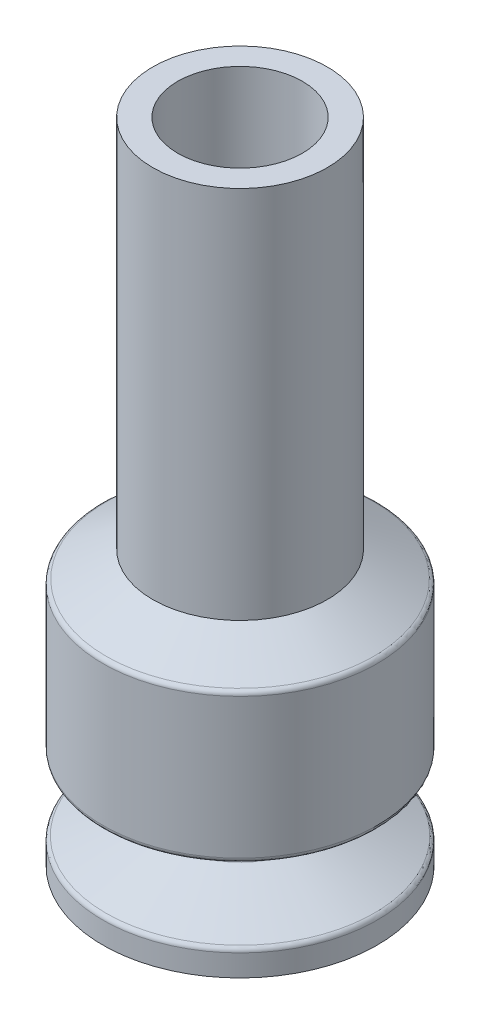
ISO-10303-21;
HEADER;
FILE_DESCRIPTION(('STEP AP214'),'2;1');
FILE_NAME('part.step','',(''),(''),'','','');
FILE_SCHEMA(('AUTOMOTIVE_DESIGN { 1 0 10303 214 1 1 1 1 }'));
ENDSEC;
DATA;
#1=APPLICATION_CONTEXT('core data for automotive mechanical design processes');
#2=APPLICATION_PROTOCOL_DEFINITION('international standard','automotive_design',2000,#1);
#3=PRODUCT_CONTEXT('',#1,'mechanical');
#4=PRODUCT('Part','Part','',(#3));
#5=PRODUCT_RELATED_PRODUCT_CATEGORY('part','',(#4));
#6=PRODUCT_DEFINITION_FORMATION('','',#4);
#7=PRODUCT_DEFINITION_CONTEXT('part definition',#1,'design');
#8=PRODUCT_DEFINITION('design','',#6,#7);
#9=PRODUCT_DEFINITION_SHAPE('','',#8);
#10=(LENGTH_UNIT() NAMED_UNIT(*) SI_UNIT(.MILLI.,.METRE.));
#11=(NAMED_UNIT(*) PLANE_ANGLE_UNIT() SI_UNIT($,.RADIAN.));
#12=(NAMED_UNIT(*) SI_UNIT($,.STERADIAN.) SOLID_ANGLE_UNIT());
#13=UNCERTAINTY_MEASURE_WITH_UNIT(LENGTH_MEASURE(1.E-05),#10,'distance_accuracy_value','');
#14=(GEOMETRIC_REPRESENTATION_CONTEXT(3) GLOBAL_UNCERTAINTY_ASSIGNED_CONTEXT((#13)) GLOBAL_UNIT_ASSIGNED_CONTEXT((#10,
#11,#12)) REPRESENTATION_CONTEXT('',''));
#15=CARTESIAN_POINT('',(0.,0.,0.));
#16=DIRECTION('',(0.,0.,1.));
#17=DIRECTION('',(1.,0.,0.));
#18=AXIS2_PLACEMENT_3D('',#15,#16,#17);
#19=CARTESIAN_POINT('',(5.5,0.,0.));
#20=DIRECTION('',(0.,-1.,0.));
#21=DIRECTION('',(0.,0.,-1.));
#22=AXIS2_PLACEMENT_3D('',#19,#20,#21);
#23=PLANE('',#22);
#24=CARTESIAN_POINT('',(0.,0.,0.));
#25=DIRECTION('',(0.,-1.,0.));
#26=DIRECTION('',(0.,0.,-1.));
#27=AXIS2_PLACEMENT_3D('',#24,#25,#26);
#28=CIRCLE('',#27,5.5);
#29=CARTESIAN_POINT('',(0.,0.,-5.5));
#30=VERTEX_POINT('',#29);
#31=EDGE_CURVE('E10',#30,#30,#28,.T.);
#32=ORIENTED_EDGE('',*,*,#31,.T.);
#33=EDGE_LOOP('',(#32));
#34=FACE_BOUND('',#33,.T.);
#35=CARTESIAN_POINT('',(0.,0.,0.));
#36=DIRECTION('',(0.,-1.,0.));
#37=DIRECTION('',(0.,0.,-1.));
#38=AXIS2_PLACEMENT_3D('',#35,#36,#37);
#39=CIRCLE('',#38,5.);
#40=CARTESIAN_POINT('',(0.,0.,-5.));
#41=VERTEX_POINT('',#40);
#42=EDGE_CURVE('E122',#41,#41,#39,.T.);
#43=ORIENTED_EDGE('',*,*,#42,.F.);
#44=EDGE_LOOP('',(#43));
#45=FACE_BOUND('',#44,.T.);
#46=ADVANCED_FACE('F39',(#34,#45),#23,.T.);
#47=CARTESIAN_POINT('',(0.,0.,0.));
#48=DIRECTION('',(0.,-1.,0.));
#49=DIRECTION('',(0.,0.,-1.));
#50=AXIS2_PLACEMENT_3D('',#47,#48,#49);
#51=CYLINDRICAL_SURFACE('',#50,5.5);
#52=CARTESIAN_POINT('',(0.,0.86919129160199,0.));
#53=DIRECTION('',(0.,-1.,0.));
#54=DIRECTION('',(0.,0.,-1.));
#55=AXIS2_PLACEMENT_3D('',#52,#53,#54);
#56=CIRCLE('',#55,5.5);
#57=CARTESIAN_POINT('',(0.,0.86919129160199,-5.5));
#58=VERTEX_POINT('',#57);
#59=EDGE_CURVE('E46',#58,#58,#56,.T.);
#60=ORIENTED_EDGE('',*,*,#59,.T.);
#61=EDGE_LOOP('',(#60));
#62=FACE_BOUND('',#61,.T.);
#63=ORIENTED_EDGE('',*,*,#31,.F.);
#64=EDGE_LOOP('',(#63));
#65=FACE_BOUND('',#64,.T.);
#66=ADVANCED_FACE('F158',(#62,#65),#51,.T.);
#67=CARTESIAN_POINT('',(0.,0.869191291601991,0.));
#68=DIRECTION('',(0.,-1.,0.));
#69=DIRECTION('',(0.,0.,-1.));
#70=AXIS2_PLACEMENT_3D('',#67,#68,#69);
#71=TOROIDAL_SURFACE('',#70,5.3,0.2);
#72=CARTESIAN_POINT('',(0.,1.05242589897639,0.));
#73=DIRECTION('',(0.,-1.,0.));
#74=DIRECTION('',(0.,0.,-1.));
#75=AXIS2_PLACEMENT_3D('',#72,#73,#74);
#76=CIRCLE('',#75,5.38015658837769);
#77=CARTESIAN_POINT('',(0.,1.05242589897639,-5.38015658837769));
#78=VERTEX_POINT('',#77);
#79=EDGE_CURVE('E51',#78,#78,#76,.T.);
#80=ORIENTED_EDGE('',*,*,#79,.T.);
#81=EDGE_LOOP('',(#80));
#82=FACE_BOUND('',#81,.T.);
#83=ORIENTED_EDGE('',*,*,#59,.F.);
#84=EDGE_LOOP('',(#83));
#85=FACE_BOUND('',#84,.T.);
#86=ADVANCED_FACE('F162',(#82,#85),#71,.T.);
#87=CARTESIAN_POINT('',(0.,1.05242589897639,0.));
#88=DIRECTION('',(0.,-1.,0.));
#89=DIRECTION('',(0.,0.,-1.));
#90=AXIS2_PLACEMENT_3D('',#87,#88,#89);
#91=CONICAL_SURFACE('',#90,5.38015658837769,1.15842506168204);
#92=CARTESIAN_POINT('',(0.,2.15377338917274,0.));
#93=DIRECTION('',(0.,-1.,0.));
#94=DIRECTION('',(0.,0.,-1.));
#95=AXIS2_PLACEMENT_3D('',#92,#93,#94);
#96=CIRCLE('',#95,2.86252230486744);
#97=CARTESIAN_POINT('',(0.,2.15377338917274,-2.86252230486744));
#98=VERTEX_POINT('',#97);
#99=EDGE_CURVE('E56',#98,#98,#96,.T.);
#100=ORIENTED_EDGE('',*,*,#99,.T.);
#101=EDGE_LOOP('',(#100));
#102=FACE_BOUND('',#101,.T.);
#103=ORIENTED_EDGE('',*,*,#79,.F.);
#104=EDGE_LOOP('',(#103));
#105=FACE_BOUND('',#104,.T.);
#106=ADVANCED_FACE('F248',(#102,#105),#91,.T.);
#107=CARTESIAN_POINT('',(0.,2.33700799654713,0.));
#108=DIRECTION('',(0.,-1.,0.));
#109=DIRECTION('',(0.,0.,-1.));
#110=AXIS2_PLACEMENT_3D('',#107,#108,#109);
#111=TOROIDAL_SURFACE('',#110,2.94267889324513,0.2);
#112=CARTESIAN_POINT('',(0.,2.51021146886683,0.));
#113=DIRECTION('',(0.,-1.,0.));
#114=DIRECTION('',(0.,0.,-1.));
#115=AXIS2_PLACEMENT_3D('',#112,#113,#114);
#116=CIRCLE('',#115,2.84267610740194);
#117=CARTESIAN_POINT('',(0.,2.51021146886683,-2.84267610740194));
#118=VERTEX_POINT('',#117);
#119=EDGE_CURVE('E62',#118,#118,#116,.T.);
#120=ORIENTED_EDGE('',*,*,#119,.T.);
#121=EDGE_LOOP('',(#120));
#122=FACE_BOUND('',#121,.T.);
#123=ORIENTED_EDGE('',*,*,#99,.F.);
#124=EDGE_LOOP('',(#123));
#125=FACE_BOUND('',#124,.T.);
#126=ADVANCED_FACE('F244',(#122,#125),#111,.F.);
#127=CARTESIAN_POINT('',(0.,2.51021146886683,0.));
#128=DIRECTION('',(0.,1.,0.));
#129=DIRECTION('',(0.,0.,1.));
#130=AXIS2_PLACEMENT_3D('',#127,#128,#129);
#131=CONICAL_SURFACE('',#130,2.84267610740194,1.04718146704874);
#132=CARTESIAN_POINT('',(0.,3.98673955880723,0.));
#133=DIRECTION('',(0.,-1.,0.));
#134=DIRECTION('',(0.,0.,-1.));
#135=AXIS2_PLACEMENT_3D('',#132,#133,#134);
#136=CIRCLE('',#135,5.40000278584319);
#137=CARTESIAN_POINT('',(0.,3.98673955880723,-5.40000278584319));
#138=VERTEX_POINT('',#137);
#139=EDGE_CURVE('E66',#138,#138,#136,.T.);
#140=ORIENTED_EDGE('',*,*,#139,.T.);
#141=EDGE_LOOP('',(#140));
#142=FACE_BOUND('',#141,.T.);
#143=ORIENTED_EDGE('',*,*,#119,.F.);
#144=EDGE_LOOP('',(#143));
#145=FACE_BOUND('',#144,.T.);
#146=ADVANCED_FACE('F240',(#142,#145),#131,.T.);
#147=CARTESIAN_POINT('',(0.,4.15994303112693,0.));
#148=DIRECTION('',(0.,-1.,0.));
#149=DIRECTION('',(0.,0.,-1.));
#150=AXIS2_PLACEMENT_3D('',#147,#148,#149);
#151=TOROIDAL_SURFACE('',#150,5.3,0.2);
#152=CARTESIAN_POINT('',(0.,4.15994303112693,0.));
#153=DIRECTION('',(0.,-1.,0.));
#154=DIRECTION('',(0.,0.,-1.));
#155=AXIS2_PLACEMENT_3D('',#152,#153,#154);
#156=CIRCLE('',#155,5.5);
#157=CARTESIAN_POINT('',(0.,4.15994303112693,-5.5));
#158=VERTEX_POINT('',#157);
#159=EDGE_CURVE('E70',#158,#158,#156,.T.);
#160=ORIENTED_EDGE('',*,*,#159,.T.);
#161=EDGE_LOOP('',(#160));
#162=FACE_BOUND('',#161,.T.);
#163=ORIENTED_EDGE('',*,*,#139,.F.);
#164=EDGE_LOOP('',(#163));
#165=FACE_BOUND('',#164,.T.);
#166=ADVANCED_FACE('F236',(#162,#165),#151,.T.);
#167=CARTESIAN_POINT('',(0.,0.,0.));
#168=DIRECTION('',(0.,-1.,0.));
#169=DIRECTION('',(0.,0.,-1.));
#170=AXIS2_PLACEMENT_3D('',#167,#168,#169);
#171=CYLINDRICAL_SURFACE('',#170,5.5);
#172=CARTESIAN_POINT('',(0.,9.7769760752791,0.));
#173=DIRECTION('',(0.,-1.,0.));
#174=DIRECTION('',(0.,0.,-1.));
#175=AXIS2_PLACEMENT_3D('',#172,#173,#174);
#176=CIRCLE('',#175,5.5);
#177=CARTESIAN_POINT('',(0.,9.7769760752791,-5.5));
#178=VERTEX_POINT('',#177);
#179=EDGE_CURVE('E74',#178,#178,#176,.T.);
#180=ORIENTED_EDGE('',*,*,#179,.T.);
#181=EDGE_LOOP('',(#180));
#182=FACE_BOUND('',#181,.T.);
#183=ORIENTED_EDGE('',*,*,#159,.F.);
#184=EDGE_LOOP('',(#183));
#185=FACE_BOUND('',#184,.T.);
#186=ADVANCED_FACE('F232',(#182,#185),#171,.T.);
#187=CARTESIAN_POINT('',(0.,9.7769760752791,0.));
#188=DIRECTION('',(0.,-1.,0.));
#189=DIRECTION('',(0.,0.,-1.));
#190=AXIS2_PLACEMENT_3D('',#187,#188,#189);
#191=TOROIDAL_SURFACE('',#190,5.3,0.2);
#192=CARTESIAN_POINT('',(0.,9.9651021026022,0.));
#193=DIRECTION('',(0.,-1.,0.));
#194=DIRECTION('',(0.,0.,-1.));
#195=AXIS2_PLACEMENT_3D('',#192,#193,#194);
#196=CIRCLE('',#195,5.3678866543853);
#197=CARTESIAN_POINT('',(0.,9.9651021026022,-5.3678866543853));
#198=VERTEX_POINT('',#197);
#199=EDGE_CURVE('E78',#198,#198,#196,.T.);
#200=ORIENTED_EDGE('',*,*,#199,.T.);
#201=EDGE_LOOP('',(#200));
#202=FACE_BOUND('',#201,.T.);
#203=ORIENTED_EDGE('',*,*,#179,.F.);
#204=EDGE_LOOP('',(#203));
#205=FACE_BOUND('',#204,.T.);
#206=ADVANCED_FACE('F226',(#202,#205),#191,.T.);
#207=CARTESIAN_POINT('',(0.,9.9651021026022,0.));
#208=DIRECTION('',(0.,-1.,0.));
#209=DIRECTION('',(0.,0.,-1.));
#210=AXIS2_PLACEMENT_3D('',#207,#208,#209);
#211=CONICAL_SURFACE('',#210,5.3678866543853,1.06485095603255);
#212=CARTESIAN_POINT('',(0.,11.,0.));
#213=DIRECTION('',(0.,1.,0.));
#214=DIRECTION('',(0.,0.,1.));
#215=AXIS2_PLACEMENT_3D('',#212,#213,#214);
#216=CIRCLE('',#215,3.5);
#217=CARTESIAN_POINT('',(0.,11.,3.5));
#218=VERTEX_POINT('',#217);
#219=EDGE_CURVE('E127',#218,#218,#216,.T.);
#220=ORIENTED_EDGE('',*,*,#219,.F.);
#221=EDGE_LOOP('',(#220));
#222=FACE_BOUND('',#221,.T.);
#223=ORIENTED_EDGE('',*,*,#199,.F.);
#224=EDGE_LOOP('',(#223));
#225=FACE_BOUND('',#224,.T.);
#226=ADVANCED_FACE('F221',(#222,#225),#211,.T.);
#227=CARTESIAN_POINT('',(0.,0.,0.));
#228=DIRECTION('',(0.,-1.,0.));
#229=DIRECTION('',(0.,0.,-1.));
#230=AXIS2_PLACEMENT_3D('',#227,#228,#229);
#231=CYLINDRICAL_SURFACE('',#230,2.5);
#232=CARTESIAN_POINT('',(0.,10.4684414409695,0.));
#233=DIRECTION('',(0.,-1.,0.));
#234=DIRECTION('',(0.,0.,-1.));
#235=AXIS2_PLACEMENT_3D('',#232,#233,#234);
#236=CIRCLE('',#235,2.5);
#237=CARTESIAN_POINT('',(0.,10.4684414409695,-2.5));
#238=VERTEX_POINT('',#237);
#239=EDGE_CURVE('E82',#238,#238,#236,.T.);
#240=ORIENTED_EDGE('',*,*,#239,.T.);
#241=EDGE_LOOP('',(#240));
#242=FACE_BOUND('',#241,.T.);
#243=CARTESIAN_POINT('',(0.,26.,0.));
#244=DIRECTION('',(0.,1.,0.));
#245=DIRECTION('',(0.,0.,1.));
#246=AXIS2_PLACEMENT_3D('',#243,#244,#245);
#247=CIRCLE('',#246,2.5);
#248=CARTESIAN_POINT('',(0.,26.,2.5));
#249=VERTEX_POINT('',#248);
#250=EDGE_CURVE('E131',#249,#249,#247,.T.);
#251=ORIENTED_EDGE('',*,*,#250,.T.);
#252=EDGE_LOOP('',(#251));
#253=FACE_BOUND('',#252,.T.);
#254=ADVANCED_FACE('F139',(#242,#253),#231,.F.);
#255=CARTESIAN_POINT('',(3.5,10.4684414409695,0.));
#256=DIRECTION('',(0.,-1.,0.));
#257=DIRECTION('',(0.,0.,-1.));
#258=AXIS2_PLACEMENT_3D('',#255,#256,#257);
#259=PLANE('',#258);
#260=CARTESIAN_POINT('',(0.,10.4684414409695,0.));
#261=DIRECTION('',(0.,-1.,0.));
#262=DIRECTION('',(0.,0.,-1.));
#263=AXIS2_PLACEMENT_3D('',#260,#261,#262);
#264=CIRCLE('',#263,3.5);
#265=CARTESIAN_POINT('',(0.,10.4684414409695,-3.5));
#266=VERTEX_POINT('',#265);
#267=EDGE_CURVE('E86',#266,#266,#264,.T.);
#268=ORIENTED_EDGE('',*,*,#267,.T.);
#269=EDGE_LOOP('',(#268));
#270=FACE_BOUND('',#269,.T.);
#271=ORIENTED_EDGE('',*,*,#239,.F.);
#272=EDGE_LOOP('',(#271));
#273=FACE_BOUND('',#272,.T.);
#274=ADVANCED_FACE('F212',(#270,#273),#259,.T.);
#275=CARTESIAN_POINT('',(0.,10.4684414409695,0.));
#276=DIRECTION('',(0.,-1.,0.));
#277=DIRECTION('',(0.,0.,-1.));
#278=AXIS2_PLACEMENT_3D('',#275,#276,#277);
#279=CONICAL_SURFACE('',#278,3.5,1.01243883029531);
#280=CARTESIAN_POINT('',(0.,9.61397220448395,0.));
#281=DIRECTION('',(0.,-1.,0.));
#282=DIRECTION('',(0.,0.,-1.));
#283=AXIS2_PLACEMENT_3D('',#280,#281,#282);
#284=CIRCLE('',#283,4.8678866543853);
#285=CARTESIAN_POINT('',(0.,9.61397220448395,-4.8678866543853));
#286=VERTEX_POINT('',#285);
#287=EDGE_CURVE('E90',#286,#286,#284,.T.);
#288=ORIENTED_EDGE('',*,*,#287,.T.);
#289=EDGE_LOOP('',(#288));
#290=FACE_BOUND('',#289,.T.);
#291=ORIENTED_EDGE('',*,*,#267,.F.);
#292=EDGE_LOOP('',(#291));
#293=FACE_BOUND('',#292,.T.);
#294=ADVANCED_FACE('F206',(#290,#293),#279,.F.);
#295=CARTESIAN_POINT('',(0.,9.42584617716085,0.));
#296=DIRECTION('',(0.,-1.,0.));
#297=DIRECTION('',(0.,0.,-1.));
#298=AXIS2_PLACEMENT_3D('',#295,#296,#297);
#299=TOROIDAL_SURFACE('',#298,4.8,0.2);
#300=CARTESIAN_POINT('',(0.,9.42584617716085,0.));
#301=DIRECTION('',(0.,-1.,0.));
#302=DIRECTION('',(0.,0.,-1.));
#303=AXIS2_PLACEMENT_3D('',#300,#301,#302);
#304=CIRCLE('',#303,5.);
#305=CARTESIAN_POINT('',(0.,9.42584617716085,-5.));
#306=VERTEX_POINT('',#305);
#307=EDGE_CURVE('E94',#306,#306,#304,.T.);
#308=ORIENTED_EDGE('',*,*,#307,.T.);
#309=EDGE_LOOP('',(#308));
#310=FACE_BOUND('',#309,.T.);
#311=ORIENTED_EDGE('',*,*,#287,.F.);
#312=EDGE_LOOP('',(#311));
#313=FACE_BOUND('',#312,.T.);
#314=ADVANCED_FACE('F200',(#310,#313),#299,.F.);
#315=CARTESIAN_POINT('',(0.,0.,0.));
#316=DIRECTION('',(0.,-1.,0.));
#317=DIRECTION('',(0.,0.,-1.));
#318=AXIS2_PLACEMENT_3D('',#315,#316,#317);
#319=CYLINDRICAL_SURFACE('',#318,5.);
#320=CARTESIAN_POINT('',(0.,4.44861280436401,0.));
#321=DIRECTION('',(0.,-1.,0.));
#322=DIRECTION('',(0.,0.,-1.));
#323=AXIS2_PLACEMENT_3D('',#320,#321,#322);
#324=CIRCLE('',#323,5.);
#325=CARTESIAN_POINT('',(0.,4.44861280436401,-5.));
#326=VERTEX_POINT('',#325);
#327=EDGE_CURVE('E98',#326,#326,#324,.T.);
#328=ORIENTED_EDGE('',*,*,#327,.T.);
#329=EDGE_LOOP('',(#328));
#330=FACE_BOUND('',#329,.T.);
#331=ORIENTED_EDGE('',*,*,#307,.F.);
#332=EDGE_LOOP('',(#331));
#333=FACE_BOUND('',#332,.T.);
#334=ADVANCED_FACE('F194',(#330,#333),#319,.F.);
#335=CARTESIAN_POINT('',(0.,4.44861280436401,0.));
#336=DIRECTION('',(0.,-1.,0.));
#337=DIRECTION('',(0.,0.,-1.));
#338=AXIS2_PLACEMENT_3D('',#335,#336,#337);
#339=TOROIDAL_SURFACE('',#338,4.8,0.2);
#340=CARTESIAN_POINT('',(0.,4.27540933204431,0.));
#341=DIRECTION('',(0.,-1.,0.));
#342=DIRECTION('',(0.,0.,-1.));
#343=AXIS2_PLACEMENT_3D('',#340,#341,#342);
#344=CIRCLE('',#343,4.90000278584319);
#345=CARTESIAN_POINT('',(0.,4.27540933204431,-4.90000278584319));
#346=VERTEX_POINT('',#345);
#347=EDGE_CURVE('E102',#346,#346,#344,.T.);
#348=ORIENTED_EDGE('',*,*,#347,.T.);
#349=EDGE_LOOP('',(#348));
#350=FACE_BOUND('',#349,.T.);
#351=ORIENTED_EDGE('',*,*,#327,.F.);
#352=EDGE_LOOP('',(#351));
#353=FACE_BOUND('',#352,.T.);
#354=ADVANCED_FACE('F188',(#350,#353),#339,.F.);
#355=CARTESIAN_POINT('',(0.,4.27540933204431,0.));
#356=DIRECTION('',(0.,1.,0.));
#357=DIRECTION('',(0.,0.,1.));
#358=AXIS2_PLACEMENT_3D('',#355,#356,#357);
#359=CONICAL_SURFACE('',#358,4.90000278584319,1.04718146704874);
#360=CARTESIAN_POINT('',(0.,2.54751716608106,0.));
#361=DIRECTION('',(0.,-1.,0.));
#362=DIRECTION('',(0.,0.,-1.));
#363=AXIS2_PLACEMENT_3D('',#360,#361,#362);
#364=CIRCLE('',#363,1.90731692799009);
#365=CARTESIAN_POINT('',(0.,2.54751716608106,-1.90731692799009));
#366=VERTEX_POINT('',#365);
#367=EDGE_CURVE('E106',#366,#366,#364,.T.);
#368=ORIENTED_EDGE('',*,*,#367,.T.);
#369=EDGE_LOOP('',(#368));
#370=FACE_BOUND('',#369,.T.);
#371=ORIENTED_EDGE('',*,*,#347,.F.);
#372=EDGE_LOOP('',(#371));
#373=FACE_BOUND('',#372,.T.);
#374=ADVANCED_FACE('F182',(#370,#373),#359,.F.);
#375=CARTESIAN_POINT('',(0.,2.28771195760151,0.));
#376=DIRECTION('',(0.,-1.,0.));
#377=DIRECTION('',(0.,0.,-1.));
#378=AXIS2_PLACEMENT_3D('',#375,#376,#377);
#379=TOROIDAL_SURFACE('',#378,2.05732110675487,0.3);
#380=CARTESIAN_POINT('',(0.,2.01286004653992,0.));
#381=DIRECTION('',(0.,-1.,0.));
#382=DIRECTION('',(0.,0.,-1.));
#383=AXIS2_PLACEMENT_3D('',#380,#381,#382);
#384=CIRCLE('',#383,1.93708622418834);
#385=CARTESIAN_POINT('',(0.,2.01286004653992,-1.93708622418834));
#386=VERTEX_POINT('',#385);
#387=EDGE_CURVE('E110',#386,#386,#384,.T.);
#388=ORIENTED_EDGE('',*,*,#387,.T.);
#389=EDGE_LOOP('',(#388));
#390=FACE_BOUND('',#389,.T.);
#391=ORIENTED_EDGE('',*,*,#367,.F.);
#392=EDGE_LOOP('',(#391));
#393=FACE_BOUND('',#392,.T.);
#394=ADVANCED_FACE('F176',(#390,#393),#379,.T.);
#395=CARTESIAN_POINT('',(0.,2.01286004653992,0.));
#396=DIRECTION('',(0.,-1.,0.));
#397=DIRECTION('',(0.,0.,-1.));
#398=AXIS2_PLACEMENT_3D('',#395,#396,#397);
#399=CONICAL_SURFACE('',#398,1.93708622418834,1.15842506168204);
#400=CARTESIAN_POINT('',(0.,0.725404127981363,0.));
#401=DIRECTION('',(0.,-1.,0.));
#402=DIRECTION('',(0.,0.,-1.));
#403=AXIS2_PLACEMENT_3D('',#400,#401,#402);
#404=CIRCLE('',#403,4.88015658837769);
#405=CARTESIAN_POINT('',(0.,0.725404127981363,-4.88015658837769));
#406=VERTEX_POINT('',#405);
#407=EDGE_CURVE('E114',#406,#406,#404,.T.);
#408=ORIENTED_EDGE('',*,*,#407,.T.);
#409=EDGE_LOOP('',(#408));
#410=FACE_BOUND('',#409,.T.);
#411=ORIENTED_EDGE('',*,*,#387,.F.);
#412=EDGE_LOOP('',(#411));
#413=FACE_BOUND('',#412,.T.);
#414=ADVANCED_FACE('F170',(#410,#413),#399,.F.);
#415=CARTESIAN_POINT('',(0.,0.542169520606967,0.));
#416=DIRECTION('',(0.,-1.,0.));
#417=DIRECTION('',(0.,0.,-1.));
#418=AXIS2_PLACEMENT_3D('',#415,#416,#417);
#419=TOROIDAL_SURFACE('',#418,4.8,0.2);
#420=CARTESIAN_POINT('',(0.,0.542169520606966,0.));
#421=DIRECTION('',(0.,-1.,0.));
#422=DIRECTION('',(0.,0.,-1.));
#423=AXIS2_PLACEMENT_3D('',#420,#421,#422);
#424=CIRCLE('',#423,5.);
#425=CARTESIAN_POINT('',(0.,0.542169520606966,-5.));
#426=VERTEX_POINT('',#425);
#427=EDGE_CURVE('E118',#426,#426,#424,.T.);
#428=ORIENTED_EDGE('',*,*,#427,.T.);
#429=EDGE_LOOP('',(#428));
#430=FACE_BOUND('',#429,.T.);
#431=ORIENTED_EDGE('',*,*,#407,.F.);
#432=EDGE_LOOP('',(#431));
#433=FACE_BOUND('',#432,.T.);
#434=ADVANCED_FACE('F154',(#430,#433),#419,.F.);
#435=CARTESIAN_POINT('',(0.,0.,0.));
#436=DIRECTION('',(0.,-1.,0.));
#437=DIRECTION('',(0.,0.,-1.));
#438=AXIS2_PLACEMENT_3D('',#435,#436,#437);
#439=CYLINDRICAL_SURFACE('',#438,5.);
#440=ORIENTED_EDGE('',*,*,#42,.T.);
#441=EDGE_LOOP('',(#440));
#442=FACE_BOUND('',#441,.T.);
#443=ORIENTED_EDGE('',*,*,#427,.F.);
#444=EDGE_LOOP('',(#443));
#445=FACE_BOUND('',#444,.T.);
#446=ADVANCED_FACE('F144',(#442,#445),#439,.F.);
#447=CARTESIAN_POINT('',(0.,26.,0.));
#448=DIRECTION('',(0.,1.,0.));
#449=DIRECTION('',(0.,0.,1.));
#450=AXIS2_PLACEMENT_3D('',#447,#448,#449);
#451=PLANE('',#450);
#452=CARTESIAN_POINT('',(0.,26.,0.));
#453=DIRECTION('',(0.,1.,0.));
#454=DIRECTION('',(0.,0.,1.));
#455=AXIS2_PLACEMENT_3D('',#452,#453,#454);
#456=CIRCLE('',#455,3.5);
#457=CARTESIAN_POINT('',(0.,26.,3.5));
#458=VERTEX_POINT('',#457);
#459=EDGE_CURVE('E126',#458,#458,#456,.T.);
#460=ORIENTED_EDGE('',*,*,#459,.T.);
#461=EDGE_LOOP('',(#460));
#462=FACE_BOUND('',#461,.T.);
#463=ORIENTED_EDGE('',*,*,#250,.F.);
#464=EDGE_LOOP('',(#463));
#465=FACE_BOUND('',#464,.T.);
#466=ADVANCED_FACE('F141',(#462,#465),#451,.T.);
#467=CARTESIAN_POINT('',(0.,26.,0.));
#468=DIRECTION('',(0.,-1.,0.));
#469=DIRECTION('',(0.,0.,-1.));
#470=AXIS2_PLACEMENT_3D('',#467,#468,#469);
#471=CYLINDRICAL_SURFACE('',#470,3.5);
#472=ORIENTED_EDGE('',*,*,#459,.F.);
#473=EDGE_LOOP('',(#472));
#474=FACE_BOUND('',#473,.T.);
#475=ORIENTED_EDGE('',*,*,#219,.T.);
#476=EDGE_LOOP('',(#475));
#477=FACE_BOUND('',#476,.T.);
#478=ADVANCED_FACE('F143',(#474,#477),#471,.T.);
#479=CLOSED_SHELL('',(#46,#66,#86,#106,#126,#146,#166,#186,#206,#226,#254,#274,#294,#314,#334,
#354,#374,#394,#414,#434,#446,#466,#478));
#480=MANIFOLD_SOLID_BREP('B2',#479);
#481=ADVANCED_BREP_SHAPE_REPRESENTATION('',(#18,#480),#14);
#482=SHAPE_DEFINITION_REPRESENTATION(#9,#481);
ENDSEC;
END-ISO-10303-21;
